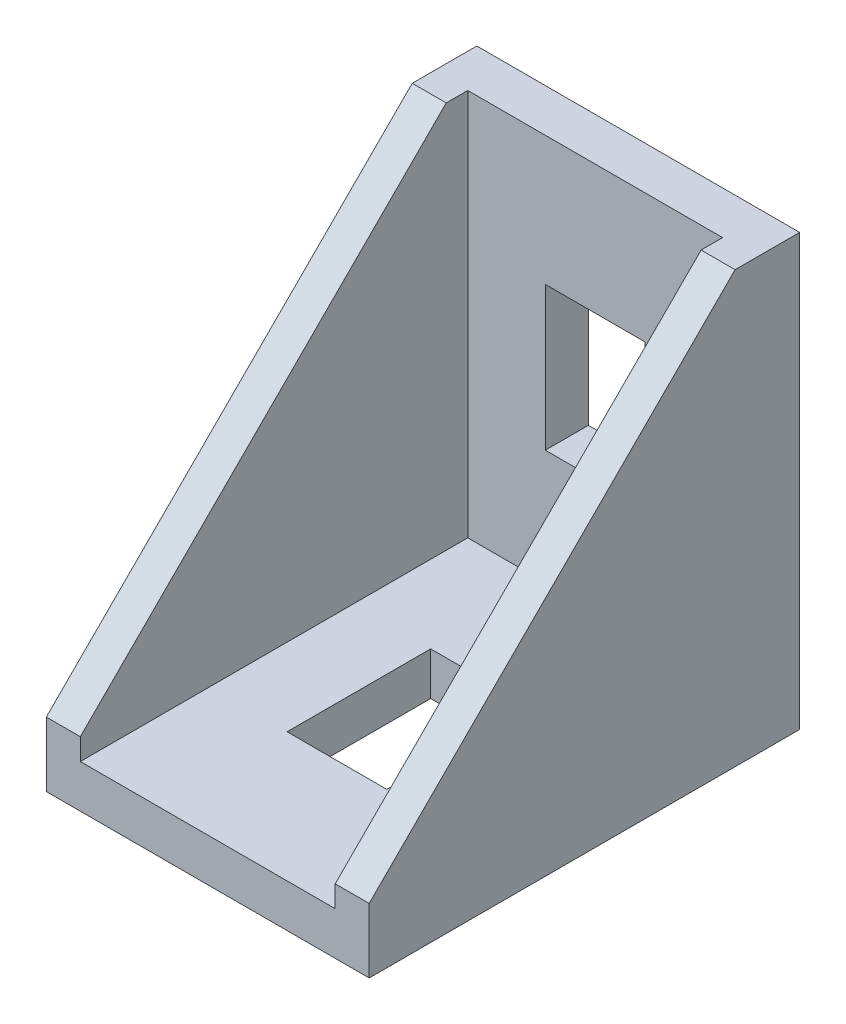
ISO-10303-21;
HEADER;
FILE_DESCRIPTION(('STEP AP214'),'2;1');
FILE_NAME('part.step','',(''),(''),'','','');
FILE_SCHEMA(('AUTOMOTIVE_DESIGN { 1 0 10303 214 1 1 1 1 }'));
ENDSEC;
DATA;
#1=APPLICATION_CONTEXT('core data for automotive mechanical design processes');
#2=APPLICATION_PROTOCOL_DEFINITION('international standard','automotive_design',2000,#1);
#3=PRODUCT_CONTEXT('',#1,'mechanical');
#4=PRODUCT('Part','Part','',(#3));
#5=PRODUCT_RELATED_PRODUCT_CATEGORY('part','',(#4));
#6=PRODUCT_DEFINITION_FORMATION('','',#4);
#7=PRODUCT_DEFINITION_CONTEXT('part definition',#1,'design');
#8=PRODUCT_DEFINITION('design','',#6,#7);
#9=PRODUCT_DEFINITION_SHAPE('','',#8);
#10=(LENGTH_UNIT() NAMED_UNIT(*) SI_UNIT(.MILLI.,.METRE.));
#11=(NAMED_UNIT(*) PLANE_ANGLE_UNIT() SI_UNIT($,.RADIAN.));
#12=(NAMED_UNIT(*) SI_UNIT($,.STERADIAN.) SOLID_ANGLE_UNIT());
#13=UNCERTAINTY_MEASURE_WITH_UNIT(LENGTH_MEASURE(1.E-05),#10,'distance_accuracy_value','');
#14=(GEOMETRIC_REPRESENTATION_CONTEXT(3) GLOBAL_UNCERTAINTY_ASSIGNED_CONTEXT((#13)) GLOBAL_UNIT_ASSIGNED_CONTEXT((#10,
#11,#12)) REPRESENTATION_CONTEXT('',''));
#15=CARTESIAN_POINT('',(0.,0.,0.));
#16=DIRECTION('',(0.,0.,1.));
#17=DIRECTION('',(1.,0.,0.));
#18=AXIS2_PLACEMENT_3D('',#15,#16,#17);
#19=CARTESIAN_POINT('',(-7.5,0.,20.));
#20=DIRECTION('',(0.,1.,0.));
#21=DIRECTION('',(0.,0.,1.));
#22=AXIS2_PLACEMENT_3D('',#19,#20,#21);
#23=PLANE('',#22);
#24=DIRECTION('',(0.,0.,1.));
#25=VECTOR('',#24,1.);
#26=CARTESIAN_POINT('',(7.5,0.,20.));
#27=LINE('',#26,#25);
#28=CARTESIAN_POINT('',(7.5,0.,0.));
#29=VERTEX_POINT('',#28);
#30=CARTESIAN_POINT('',(7.5,0.,20.));
#31=VERTEX_POINT('',#30);
#32=EDGE_CURVE('E352',#29,#31,#27,.T.);
#33=ORIENTED_EDGE('',*,*,#32,.T.);
#34=DIRECTION('',(1.,0.,0.));
#35=VECTOR('',#34,1.);
#36=CARTESIAN_POINT('',(-7.5,0.,20.));
#37=LINE('',#36,#35);
#38=CARTESIAN_POINT('',(-7.5,0.,20.));
#39=VERTEX_POINT('',#38);
#40=EDGE_CURVE('E404',#39,#31,#37,.T.);
#41=ORIENTED_EDGE('',*,*,#40,.F.);
#42=DIRECTION('',(0.,0.,1.));
#43=VECTOR('',#42,1.);
#44=CARTESIAN_POINT('',(-7.5,0.,20.));
#45=LINE('',#44,#43);
#46=CARTESIAN_POINT('',(-7.5,0.,0.));
#47=VERTEX_POINT('',#46);
#48=EDGE_CURVE('E401',#47,#39,#45,.T.);
#49=ORIENTED_EDGE('',*,*,#48,.F.);
#50=DIRECTION('',(1.,0.,0.));
#51=VECTOR('',#50,1.);
#52=CARTESIAN_POINT('',(-7.5,0.,0.));
#53=LINE('',#52,#51);
#54=EDGE_CURVE('E529',#47,#29,#53,.T.);
#55=ORIENTED_EDGE('',*,*,#54,.T.);
#56=EDGE_LOOP('',(#33,#41,#49,#55));
#57=FACE_BOUND('',#56,.T.);
#58=DIRECTION('',(0.,0.,1.));
#59=VECTOR('',#58,1.);
#60=CARTESIAN_POINT('',(-2.86,0.,16.73));
#61=LINE('',#60,#59);
#62=CARTESIAN_POINT('',(-2.86,0.,16.18));
#63=VERTEX_POINT('',#62);
#64=CARTESIAN_POINT('',(-2.86,0.,17.26));
#65=VERTEX_POINT('',#64);
#66=EDGE_CURVE('E363',#63,#65,#61,.T.);
#67=ORIENTED_EDGE('',*,*,#66,.T.);
#68=DIRECTION('',(1.,0.,0.));
#69=VECTOR('',#68,1.);
#70=CARTESIAN_POINT('',(0.,0.,17.26));
#71=LINE('',#70,#69);
#72=CARTESIAN_POINT('',(2.86,0.,17.26));
#73=VERTEX_POINT('',#72);
#74=EDGE_CURVE('E361',#65,#73,#71,.T.);
#75=ORIENTED_EDGE('',*,*,#74,.T.);
#76=DIRECTION('',(0.,0.,1.));
#77=VECTOR('',#76,1.);
#78=CARTESIAN_POINT('',(2.86,0.,16.73));
#79=LINE('',#78,#77);
#80=CARTESIAN_POINT('',(2.86,0.,16.18));
#81=VERTEX_POINT('',#80);
#82=EDGE_CURVE('E328',#81,#73,#79,.T.);
#83=ORIENTED_EDGE('',*,*,#82,.F.);
#84=DIRECTION('',(-1.,0.,0.));
#85=VECTOR('',#84,1.);
#86=CARTESIAN_POINT('',(0.,0.,16.18));
#87=LINE('',#86,#85);
#88=EDGE_CURVE('E366',#81,#63,#87,.T.);
#89=ORIENTED_EDGE('',*,*,#88,.T.);
#90=EDGE_LOOP('',(#67,#75,#83,#89));
#91=FACE_BOUND('',#90,.T.);
#92=DIRECTION('',(0.,0.,1.));
#93=VECTOR('',#92,1.);
#94=CARTESIAN_POINT('',(-2.86,0.,2.65));
#95=LINE('',#94,#93);
#96=CARTESIAN_POINT('',(-2.86,0.,2.1));
#97=VERTEX_POINT('',#96);
#98=CARTESIAN_POINT('',(-2.86,0.,3.18));
#99=VERTEX_POINT('',#98);
#100=EDGE_CURVE('E370',#97,#99,#95,.T.);
#101=ORIENTED_EDGE('',*,*,#100,.T.);
#102=DIRECTION('',(1.,0.,0.));
#103=VECTOR('',#102,1.);
#104=CARTESIAN_POINT('',(0.,0.,3.18));
#105=LINE('',#104,#103);
#106=CARTESIAN_POINT('',(2.86,0.,3.18));
#107=VERTEX_POINT('',#106);
#108=EDGE_CURVE('E283',#99,#107,#105,.T.);
#109=ORIENTED_EDGE('',*,*,#108,.T.);
#110=DIRECTION('',(0.,0.,1.));
#111=VECTOR('',#110,1.);
#112=CARTESIAN_POINT('',(2.86,0.,2.65));
#113=LINE('',#112,#111);
#114=CARTESIAN_POINT('',(2.86,0.,2.1));
#115=VERTEX_POINT('',#114);
#116=EDGE_CURVE('E331',#115,#107,#113,.T.);
#117=ORIENTED_EDGE('',*,*,#116,.F.);
#118=DIRECTION('',(-1.,0.,0.));
#119=VECTOR('',#118,1.);
#120=CARTESIAN_POINT('',(0.,0.,2.1));
#121=LINE('',#120,#119);
#122=EDGE_CURVE('E372',#115,#97,#121,.T.);
#123=ORIENTED_EDGE('',*,*,#122,.T.);
#124=EDGE_LOOP('',(#101,#109,#117,#123));
#125=FACE_BOUND('',#124,.T.);
#126=DIRECTION('',(0.,0.,-1.));
#127=VECTOR('',#126,1.);
#128=CARTESIAN_POINT('',(-2.315,0.,9.63000000000002));
#129=LINE('',#128,#127);
#130=CARTESIAN_POINT('',(-2.315,0.,14.));
#131=VERTEX_POINT('',#130);
#132=CARTESIAN_POINT('',(-2.315,0.,7.33));
#133=VERTEX_POINT('',#132);
#134=EDGE_CURVE('E381',#131,#133,#129,.T.);
#135=ORIENTED_EDGE('',*,*,#134,.F.);
#136=DIRECTION('',(-1.,0.,0.));
#137=VECTOR('',#136,1.);
#138=CARTESIAN_POINT('',(0.,0.,14.));
#139=LINE('',#138,#137);
#140=CARTESIAN_POINT('',(2.315,0.,14.));
#141=VERTEX_POINT('',#140);
#142=EDGE_CURVE('E384',#141,#131,#139,.T.);
#143=ORIENTED_EDGE('',*,*,#142,.F.);
#144=DIRECTION('',(0.,0.,-1.));
#145=VECTOR('',#144,1.);
#146=CARTESIAN_POINT('',(2.315,0.,9.63000000000002));
#147=LINE('',#146,#145);
#148=CARTESIAN_POINT('',(2.315,0.,7.33));
#149=VERTEX_POINT('',#148);
#150=EDGE_CURVE('E343',#141,#149,#147,.T.);
#151=ORIENTED_EDGE('',*,*,#150,.T.);
#152=DIRECTION('',(1.,0.,0.));
#153=VECTOR('',#152,1.);
#154=CARTESIAN_POINT('',(0.,0.,7.33));
#155=LINE('',#154,#153);
#156=EDGE_CURVE('E379',#133,#149,#155,.T.);
#157=ORIENTED_EDGE('',*,*,#156,.F.);
#158=EDGE_LOOP('',(#135,#143,#151,#157));
#159=FACE_BOUND('',#158,.T.);
#160=ADVANCED_FACE('F45',(#57,#91,#125,#159),#23,.F.);
#161=CARTESIAN_POINT('',(0.,1.99999999999999,20.));
#162=DIRECTION('',(0.,-1.,0.));
#163=DIRECTION('',(0.,0.,-1.));
#164=AXIS2_PLACEMENT_3D('',#161,#162,#163);
#165=PLANE('',#164);
#166=DIRECTION('',(-1.,0.,0.));
#167=VECTOR('',#166,1.);
#168=CARTESIAN_POINT('',(0.,1.99999999999999,20.));
#169=LINE('',#168,#167);
#170=CARTESIAN_POINT('',(5.92,1.99999999999999,20.));
#171=VERTEX_POINT('',#170);
#172=CARTESIAN_POINT('',(-5.92,1.99999999999999,20.));
#173=VERTEX_POINT('',#172);
#174=EDGE_CURVE('E392',#171,#173,#169,.T.);
#175=ORIENTED_EDGE('',*,*,#174,.F.);
#176=DIRECTION('',(0.,0.,-1.));
#177=VECTOR('',#176,1.);
#178=CARTESIAN_POINT('',(5.92,1.99999999999999,20.));
#179=LINE('',#178,#177);
#180=CARTESIAN_POINT('',(5.92,2.,2.));
#181=VERTEX_POINT('',#180);
#182=EDGE_CURVE('E349',#171,#181,#179,.T.);
#183=ORIENTED_EDGE('',*,*,#182,.T.);
#184=DIRECTION('',(-1.,0.,0.));
#185=VECTOR('',#184,1.);
#186=CARTESIAN_POINT('',(0.,2.,2.));
#187=LINE('',#186,#185);
#188=CARTESIAN_POINT('',(-5.92,2.,2.));
#189=VERTEX_POINT('',#188);
#190=EDGE_CURVE('E509',#181,#189,#187,.T.);
#191=ORIENTED_EDGE('',*,*,#190,.T.);
#192=DIRECTION('',(0.,0.,-1.));
#193=VECTOR('',#192,1.);
#194=CARTESIAN_POINT('',(-5.92,1.99999999999999,20.));
#195=LINE('',#194,#193);
#196=EDGE_CURVE('E395',#173,#189,#195,.T.);
#197=ORIENTED_EDGE('',*,*,#196,.F.);
#198=EDGE_LOOP('',(#175,#183,#191,#197));
#199=FACE_BOUND('',#198,.T.);
#200=DIRECTION('',(1.,0.,0.));
#201=VECTOR('',#200,1.);
#202=CARTESIAN_POINT('',(0.,1.99999999999999,14.));
#203=LINE('',#202,#201);
#204=CARTESIAN_POINT('',(-2.315,1.99999999999999,14.));
#205=VERTEX_POINT('',#204);
#206=CARTESIAN_POINT('',(2.315,1.99999999999999,14.));
#207=VERTEX_POINT('',#206);
#208=EDGE_CURVE('E387',#205,#207,#203,.T.);
#209=ORIENTED_EDGE('',*,*,#208,.F.);
#210=DIRECTION('',(0.,0.,1.));
#211=VECTOR('',#210,1.);
#212=CARTESIAN_POINT('',(-2.315,2.,9.63000000000002));
#213=LINE('',#212,#211);
#214=CARTESIAN_POINT('',(-2.315,1.99999999999999,7.33));
#215=VERTEX_POINT('',#214);
#216=EDGE_CURVE('E375',#215,#205,#213,.T.);
#217=ORIENTED_EDGE('',*,*,#216,.F.);
#218=DIRECTION('',(-1.,0.,0.));
#219=VECTOR('',#218,1.);
#220=CARTESIAN_POINT('',(0.,2.,7.33));
#221=LINE('',#220,#219);
#222=CARTESIAN_POINT('',(2.315,2.,7.33));
#223=VERTEX_POINT('',#222);
#224=EDGE_CURVE('E377',#223,#215,#221,.T.);
#225=ORIENTED_EDGE('',*,*,#224,.F.);
#226=DIRECTION('',(0.,0.,1.));
#227=VECTOR('',#226,1.);
#228=CARTESIAN_POINT('',(2.315,2.,9.63000000000002));
#229=LINE('',#228,#227);
#230=EDGE_CURVE('E338',#223,#207,#229,.T.);
#231=ORIENTED_EDGE('',*,*,#230,.T.);
#232=EDGE_LOOP('',(#209,#217,#225,#231));
#233=FACE_BOUND('',#232,.T.);
#234=ADVANCED_FACE('F569',(#199,#233),#165,.F.);
#235=CARTESIAN_POINT('',(7.5,11.5,11.5));
#236=DIRECTION('',(0.,-0.707106781186548,-0.707106781186547));
#237=DIRECTION('',(0.,0.707106781186547,-0.707106781186548));
#238=AXIS2_PLACEMENT_3D('',#235,#236,#237);
#239=PLANE('',#238);
#240=DIRECTION('',(0.,-0.707106781186547,0.707106781186548));
#241=VECTOR('',#240,1.);
#242=CARTESIAN_POINT('',(5.92,11.5,11.5));
#243=LINE('',#242,#241);
#244=CARTESIAN_POINT('',(5.92,20.,2.99999999999999));
#245=VERTEX_POINT('',#244);
#246=CARTESIAN_POINT('',(5.92,2.99999999999999,20.));
#247=VERTEX_POINT('',#246);
#248=EDGE_CURVE('E11',#245,#247,#243,.T.);
#249=ORIENTED_EDGE('',*,*,#248,.T.);
#250=DIRECTION('',(-1.,0.,0.));
#251=VECTOR('',#250,1.);
#252=CARTESIAN_POINT('',(7.5,2.99999999999999,20.));
#253=LINE('',#252,#251);
#254=CARTESIAN_POINT('',(7.5,2.99999999999999,20.));
#255=VERTEX_POINT('',#254);
#256=EDGE_CURVE('E358',#255,#247,#253,.T.);
#257=ORIENTED_EDGE('',*,*,#256,.F.);
#258=DIRECTION('',(0.,-0.707106781186547,0.707106781186548));
#259=VECTOR('',#258,1.);
#260=CARTESIAN_POINT('',(7.5,11.5,11.5));
#261=LINE('',#260,#259);
#262=CARTESIAN_POINT('',(7.5,20.,3.));
#263=VERTEX_POINT('',#262);
#264=EDGE_CURVE('E448',#263,#255,#261,.T.);
#265=ORIENTED_EDGE('',*,*,#264,.F.);
#266=DIRECTION('',(-1.,0.,0.));
#267=VECTOR('',#266,1.);
#268=CARTESIAN_POINT('',(7.5,20.,3.));
#269=LINE('',#268,#267);
#270=EDGE_CURVE('E455',#263,#245,#269,.T.);
#271=ORIENTED_EDGE('',*,*,#270,.T.);
#272=EDGE_LOOP('',(#249,#257,#265,#271));
#273=FACE_BOUND('',#272,.T.);
#274=ADVANCED_FACE('F563',(#273),#239,.F.);
#275=CARTESIAN_POINT('',(-7.5,2.99999999999999,20.));
#276=DIRECTION('',(0.,0.,-1.));
#277=DIRECTION('',(0.,1.,0.));
#278=AXIS2_PLACEMENT_3D('',#275,#276,#277);
#279=PLANE('',#278);
#280=DIRECTION('',(0.,1.,0.));
#281=VECTOR('',#280,1.);
#282=CARTESIAN_POINT('',(5.92,1.99999999999999,20.));
#283=LINE('',#282,#281);
#284=EDGE_CURVE('E346',#171,#247,#283,.T.);
#285=ORIENTED_EDGE('',*,*,#284,.F.);
#286=ORIENTED_EDGE('',*,*,#174,.T.);
#287=DIRECTION('',(0.,1.,0.));
#288=VECTOR('',#287,1.);
#289=CARTESIAN_POINT('',(-5.92,1.99999999999999,20.));
#290=LINE('',#289,#288);
#291=CARTESIAN_POINT('',(-5.92,2.99999999999999,20.));
#292=VERTEX_POINT('',#291);
#293=EDGE_CURVE('E389',#173,#292,#290,.T.);
#294=ORIENTED_EDGE('',*,*,#293,.T.);
#295=DIRECTION('',(1.,0.,0.));
#296=VECTOR('',#295,1.);
#297=CARTESIAN_POINT('',(-7.5,2.99999999999999,20.));
#298=LINE('',#297,#296);
#299=CARTESIAN_POINT('',(-7.5,2.99999999999999,20.));
#300=VERTEX_POINT('',#299);
#301=EDGE_CURVE('E403',#300,#292,#298,.T.);
#302=ORIENTED_EDGE('',*,*,#301,.F.);
#303=DIRECTION('',(0.,1.,0.));
#304=VECTOR('',#303,1.);
#305=CARTESIAN_POINT('',(-7.5,2.99999999999999,20.));
#306=LINE('',#305,#304);
#307=EDGE_CURVE('E398',#39,#300,#306,.T.);
#308=ORIENTED_EDGE('',*,*,#307,.F.);
#309=ORIENTED_EDGE('',*,*,#40,.T.);
#310=DIRECTION('',(0.,1.,0.));
#311=VECTOR('',#310,1.);
#312=CARTESIAN_POINT('',(7.5,2.99999999999999,20.));
#313=LINE('',#312,#311);
#314=EDGE_CURVE('E355',#31,#255,#313,.T.);
#315=ORIENTED_EDGE('',*,*,#314,.T.);
#316=ORIENTED_EDGE('',*,*,#256,.T.);
#317=EDGE_LOOP('',(#285,#286,#294,#302,#308,#309,#315,#316));
#318=FACE_BOUND('',#317,.T.);
#319=ADVANCED_FACE('F550',(#318),#279,.F.);
#320=CARTESIAN_POINT('',(-7.5,20.,0.));
#321=DIRECTION('',(0.,0.,-1.));
#322=DIRECTION('',(0.,1.,0.));
#323=AXIS2_PLACEMENT_3D('',#320,#321,#322);
#324=PLANE('',#323);
#325=DIRECTION('',(0.,1.,0.));
#326=VECTOR('',#325,1.);
#327=CARTESIAN_POINT('',(2.86,2.65,0.));
#328=LINE('',#327,#326);
#329=CARTESIAN_POINT('',(2.86,2.1,0.));
#330=VERTEX_POINT('',#329);
#331=CARTESIAN_POINT('',(2.86,3.18,0.));
#332=VERTEX_POINT('',#331);
#333=EDGE_CURVE('E428',#330,#332,#328,.T.);
#334=ORIENTED_EDGE('',*,*,#333,.T.);
#335=DIRECTION('',(1.,0.,0.));
#336=VECTOR('',#335,1.);
#337=CARTESIAN_POINT('',(0.,3.18,0.));
#338=LINE('',#337,#336);
#339=CARTESIAN_POINT('',(-2.86,3.18,0.));
#340=VERTEX_POINT('',#339);
#341=EDGE_CURVE('E489',#340,#332,#338,.T.);
#342=ORIENTED_EDGE('',*,*,#341,.F.);
#343=DIRECTION('',(0.,1.,0.));
#344=VECTOR('',#343,1.);
#345=CARTESIAN_POINT('',(-2.86,2.65,0.));
#346=LINE('',#345,#344);
#347=CARTESIAN_POINT('',(-2.86,2.1,0.));
#348=VERTEX_POINT('',#347);
#349=EDGE_CURVE('E67',#348,#340,#346,.T.);
#350=ORIENTED_EDGE('',*,*,#349,.F.);
#351=DIRECTION('',(-1.,0.,0.));
#352=VECTOR('',#351,1.);
#353=CARTESIAN_POINT('',(0.,2.1,0.));
#354=LINE('',#353,#352);
#355=EDGE_CURVE('E60',#330,#348,#354,.T.);
#356=ORIENTED_EDGE('',*,*,#355,.F.);
#357=EDGE_LOOP('',(#334,#342,#350,#356));
#358=FACE_BOUND('',#357,.T.);
#359=DIRECTION('',(0.,1.,0.));
#360=VECTOR('',#359,1.);
#361=CARTESIAN_POINT('',(2.86,16.73,0.));
#362=LINE('',#361,#360);
#363=CARTESIAN_POINT('',(2.86,16.18,0.));
#364=VERTEX_POINT('',#363);
#365=CARTESIAN_POINT('',(2.86,17.26,0.));
#366=VERTEX_POINT('',#365);
#367=EDGE_CURVE('E425',#364,#366,#362,.T.);
#368=ORIENTED_EDGE('',*,*,#367,.T.);
#369=DIRECTION('',(1.,0.,0.));
#370=VECTOR('',#369,1.);
#371=CARTESIAN_POINT('',(0.,17.26,0.));
#372=LINE('',#371,#370);
#373=CARTESIAN_POINT('',(-2.86,17.26,0.));
#374=VERTEX_POINT('',#373);
#375=EDGE_CURVE('E481',#374,#366,#372,.T.);
#376=ORIENTED_EDGE('',*,*,#375,.F.);
#377=DIRECTION('',(0.,1.,0.));
#378=VECTOR('',#377,1.);
#379=CARTESIAN_POINT('',(-2.86,16.73,0.));
#380=LINE('',#379,#378);
#381=CARTESIAN_POINT('',(-2.86,16.18,0.));
#382=VERTEX_POINT('',#381);
#383=EDGE_CURVE('E483',#382,#374,#380,.T.);
#384=ORIENTED_EDGE('',*,*,#383,.F.);
#385=DIRECTION('',(-1.,0.,0.));
#386=VECTOR('',#385,1.);
#387=CARTESIAN_POINT('',(0.,16.18,0.));
#388=LINE('',#387,#386);
#389=EDGE_CURVE('E485',#364,#382,#388,.T.);
#390=ORIENTED_EDGE('',*,*,#389,.F.);
#391=EDGE_LOOP('',(#368,#376,#384,#390));
#392=FACE_BOUND('',#391,.T.);
#393=DIRECTION('',(1.,0.,0.));
#394=VECTOR('',#393,1.);
#395=CARTESIAN_POINT('',(-7.5,20.,0.));
#396=LINE('',#395,#394);
#397=CARTESIAN_POINT('',(-7.5,20.,0.));
#398=VERTEX_POINT('',#397);
#399=CARTESIAN_POINT('',(7.5,20.,0.));
#400=VERTEX_POINT('',#399);
#401=EDGE_CURVE('E532',#398,#400,#396,.T.);
#402=ORIENTED_EDGE('',*,*,#401,.T.);
#403=DIRECTION('',(0.,1.,0.));
#404=VECTOR('',#403,1.);
#405=CARTESIAN_POINT('',(7.5,20.,0.));
#406=LINE('',#405,#404);
#407=EDGE_CURVE('E452',#29,#400,#406,.T.);
#408=ORIENTED_EDGE('',*,*,#407,.F.);
#409=ORIENTED_EDGE('',*,*,#54,.F.);
#410=DIRECTION('',(0.,1.,0.));
#411=VECTOR('',#410,1.);
#412=CARTESIAN_POINT('',(-7.5,20.,0.));
#413=LINE('',#412,#411);
#414=EDGE_CURVE('E521',#47,#398,#413,.T.);
#415=ORIENTED_EDGE('',*,*,#414,.T.);
#416=EDGE_LOOP('',(#402,#408,#409,#415));
#417=FACE_BOUND('',#416,.T.);
#418=DIRECTION('',(0.,-1.,0.));
#419=VECTOR('',#418,1.);
#420=CARTESIAN_POINT('',(2.315,9.63000000000002,0.));
#421=LINE('',#420,#419);
#422=CARTESIAN_POINT('',(2.315,14.,0.));
#423=VERTEX_POINT('',#422);
#424=CARTESIAN_POINT('',(2.315,7.33,0.));
#425=VERTEX_POINT('',#424);
#426=EDGE_CURVE('E440',#423,#425,#421,.T.);
#427=ORIENTED_EDGE('',*,*,#426,.F.);
#428=DIRECTION('',(-1.,0.,0.));
#429=VECTOR('',#428,1.);
#430=CARTESIAN_POINT('',(0.,14.,0.));
#431=LINE('',#430,#429);
#432=CARTESIAN_POINT('',(-2.315,14.,0.));
#433=VERTEX_POINT('',#432);
#434=EDGE_CURVE('E501',#423,#433,#431,.T.);
#435=ORIENTED_EDGE('',*,*,#434,.T.);
#436=DIRECTION('',(0.,-1.,0.));
#437=VECTOR('',#436,1.);
#438=CARTESIAN_POINT('',(-2.315,9.63000000000002,0.));
#439=LINE('',#438,#437);
#440=CARTESIAN_POINT('',(-2.315,7.33,0.));
#441=VERTEX_POINT('',#440);
#442=EDGE_CURVE('E503',#433,#441,#439,.T.);
#443=ORIENTED_EDGE('',*,*,#442,.T.);
#444=DIRECTION('',(1.,0.,0.));
#445=VECTOR('',#444,1.);
#446=CARTESIAN_POINT('',(0.,7.33,0.));
#447=LINE('',#446,#445);
#448=EDGE_CURVE('E505',#441,#425,#447,.T.);
#449=ORIENTED_EDGE('',*,*,#448,.T.);
#450=EDGE_LOOP('',(#427,#435,#443,#449));
#451=FACE_BOUND('',#450,.T.);
#452=ADVANCED_FACE('F47',(#358,#392,#417,#451),#324,.T.);
#453=CARTESIAN_POINT('',(0.,20.,2.));
#454=DIRECTION('',(0.,0.,1.));
#455=DIRECTION('',(1.,0.,0.));
#456=AXIS2_PLACEMENT_3D('',#453,#454,#455);
#457=PLANE('',#456);
#458=DIRECTION('',(0.,-1.,0.));
#459=VECTOR('',#458,1.);
#460=CARTESIAN_POINT('',(2.315,9.63000000000002,2.));
#461=LINE('',#460,#459);
#462=CARTESIAN_POINT('',(2.315,14.,2.));
#463=VERTEX_POINT('',#462);
#464=CARTESIAN_POINT('',(2.315,7.33,2.));
#465=VERTEX_POINT('',#464);
#466=EDGE_CURVE('E435',#463,#465,#461,.T.);
#467=ORIENTED_EDGE('',*,*,#466,.T.);
#468=DIRECTION('',(1.,0.,0.));
#469=VECTOR('',#468,1.);
#470=CARTESIAN_POINT('',(0.,7.33,2.));
#471=LINE('',#470,#469);
#472=CARTESIAN_POINT('',(-2.315,7.33,2.));
#473=VERTEX_POINT('',#472);
#474=EDGE_CURVE('E507',#473,#465,#471,.T.);
#475=ORIENTED_EDGE('',*,*,#474,.F.);
#476=DIRECTION('',(0.,-1.,0.));
#477=VECTOR('',#476,1.);
#478=CARTESIAN_POINT('',(-2.315,9.63000000000002,2.));
#479=LINE('',#478,#477);
#480=CARTESIAN_POINT('',(-2.315,14.,2.));
#481=VERTEX_POINT('',#480);
#482=EDGE_CURVE('E495',#481,#473,#479,.T.);
#483=ORIENTED_EDGE('',*,*,#482,.F.);
#484=DIRECTION('',(-1.,0.,0.));
#485=VECTOR('',#484,1.);
#486=CARTESIAN_POINT('',(0.,14.,2.));
#487=LINE('',#486,#485);
#488=EDGE_CURVE('E499',#463,#481,#487,.T.);
#489=ORIENTED_EDGE('',*,*,#488,.F.);
#490=EDGE_LOOP('',(#467,#475,#483,#489));
#491=FACE_BOUND('',#490,.T.);
#492=DIRECTION('',(0.,-1.,0.));
#493=VECTOR('',#492,1.);
#494=CARTESIAN_POINT('',(-5.92,20.,2.));
#495=LINE('',#494,#493);
#496=CARTESIAN_POINT('',(-5.92,20.,2.));
#497=VERTEX_POINT('',#496);
#498=EDGE_CURVE('E514',#497,#189,#495,.T.);
#499=ORIENTED_EDGE('',*,*,#498,.T.);
#500=ORIENTED_EDGE('',*,*,#190,.F.);
#501=DIRECTION('',(0.,-1.,0.));
#502=VECTOR('',#501,1.);
#503=CARTESIAN_POINT('',(5.92,20.,2.));
#504=LINE('',#503,#502);
#505=CARTESIAN_POINT('',(5.92,20.,2.));
#506=VERTEX_POINT('',#505);
#507=EDGE_CURVE('E446',#506,#181,#504,.T.);
#508=ORIENTED_EDGE('',*,*,#507,.F.);
#509=DIRECTION('',(-1.,0.,0.));
#510=VECTOR('',#509,1.);
#511=CARTESIAN_POINT('',(0.,20.,2.));
#512=LINE('',#511,#510);
#513=EDGE_CURVE('E510',#506,#497,#512,.T.);
#514=ORIENTED_EDGE('',*,*,#513,.T.);
#515=EDGE_LOOP('',(#499,#500,#508,#514));
#516=FACE_BOUND('',#515,.T.);
#517=ADVANCED_FACE('F578',(#491,#516),#457,.T.);
#518=CARTESIAN_POINT('',(-7.5,11.5,11.5));
#519=DIRECTION('',(0.,0.707106781186548,0.707106781186547));
#520=DIRECTION('',(0.,-0.707106781186547,0.707106781186548));
#521=AXIS2_PLACEMENT_3D('',#518,#519,#520);
#522=PLANE('',#521);
#523=ORIENTED_EDGE('',*,*,#301,.T.);
#524=DIRECTION('',(0.,0.707106781186547,-0.707106781186548));
#525=VECTOR('',#524,1.);
#526=CARTESIAN_POINT('',(-5.92,11.5,11.5));
#527=LINE('',#526,#525);
#528=CARTESIAN_POINT('',(-5.92,20.,3.));
#529=VERTEX_POINT('',#528);
#530=EDGE_CURVE('E518',#292,#529,#527,.T.);
#531=ORIENTED_EDGE('',*,*,#530,.T.);
#532=DIRECTION('',(1.,0.,0.));
#533=VECTOR('',#532,1.);
#534=CARTESIAN_POINT('',(-7.5,20.,3.));
#535=LINE('',#534,#533);
#536=CARTESIAN_POINT('',(-7.5,20.,3.));
#537=VERTEX_POINT('',#536);
#538=EDGE_CURVE('E53',#537,#529,#535,.T.);
#539=ORIENTED_EDGE('',*,*,#538,.F.);
#540=DIRECTION('',(0.,-0.707106781186547,0.707106781186548));
#541=VECTOR('',#540,1.);
#542=CARTESIAN_POINT('',(-7.5,11.5,11.5));
#543=LINE('',#542,#541);
#544=EDGE_CURVE('E527',#537,#300,#543,.T.);
#545=ORIENTED_EDGE('',*,*,#544,.T.);
#546=EDGE_LOOP('',(#523,#531,#539,#545));
#547=FACE_BOUND('',#546,.T.);
#548=ADVANCED_FACE('F576',(#547),#522,.T.);
#549=CARTESIAN_POINT('',(-7.5,20.,3.));
#550=DIRECTION('',(0.,1.,0.));
#551=DIRECTION('',(0.,0.,1.));
#552=AXIS2_PLACEMENT_3D('',#549,#550,#551);
#553=PLANE('',#552);
#554=DIRECTION('',(0.,0.,1.));
#555=VECTOR('',#554,1.);
#556=CARTESIAN_POINT('',(5.92,20.,2.));
#557=LINE('',#556,#555);
#558=EDGE_CURVE('E443',#506,#245,#557,.T.);
#559=ORIENTED_EDGE('',*,*,#558,.T.);
#560=ORIENTED_EDGE('',*,*,#270,.F.);
#561=DIRECTION('',(0.,0.,1.));
#562=VECTOR('',#561,1.);
#563=CARTESIAN_POINT('',(7.5,20.,3.));
#564=LINE('',#563,#562);
#565=EDGE_CURVE('E450',#400,#263,#564,.T.);
#566=ORIENTED_EDGE('',*,*,#565,.F.);
#567=ORIENTED_EDGE('',*,*,#401,.F.);
#568=DIRECTION('',(0.,0.,1.));
#569=VECTOR('',#568,1.);
#570=CARTESIAN_POINT('',(-7.5,20.,3.));
#571=LINE('',#570,#569);
#572=EDGE_CURVE('E524',#398,#537,#571,.T.);
#573=ORIENTED_EDGE('',*,*,#572,.T.);
#574=ORIENTED_EDGE('',*,*,#538,.T.);
#575=DIRECTION('',(0.,0.,1.));
#576=VECTOR('',#575,1.);
#577=CARTESIAN_POINT('',(-5.92,20.,2.));
#578=LINE('',#577,#576);
#579=EDGE_CURVE('E512',#497,#529,#578,.T.);
#580=ORIENTED_EDGE('',*,*,#579,.F.);
#581=ORIENTED_EDGE('',*,*,#513,.F.);
#582=EDGE_LOOP('',(#559,#560,#566,#567,#573,#574,#580,#581));
#583=FACE_BOUND('',#582,.T.);
#584=ADVANCED_FACE('F558',(#583),#553,.T.);
#585=CARTESIAN_POINT('',(-7.5,0.,0.));
#586=DIRECTION('',(1.,0.,0.));
#587=DIRECTION('',(0.,0.,-1.));
#588=AXIS2_PLACEMENT_3D('',#585,#586,#587);
#589=PLANE('',#588);
#590=ORIENTED_EDGE('',*,*,#414,.F.);
#591=ORIENTED_EDGE('',*,*,#48,.T.);
#592=ORIENTED_EDGE('',*,*,#307,.T.);
#593=ORIENTED_EDGE('',*,*,#544,.F.);
#594=ORIENTED_EDGE('',*,*,#572,.F.);
#595=EDGE_LOOP('',(#590,#591,#592,#593,#594));
#596=FACE_BOUND('',#595,.T.);
#597=ADVANCED_FACE('F555',(#596),#589,.F.);
#598=CARTESIAN_POINT('',(-5.92,20.,2.));
#599=DIRECTION('',(1.,0.,0.));
#600=DIRECTION('',(0.,0.,-1.));
#601=AXIS2_PLACEMENT_3D('',#598,#599,#600);
#602=PLANE('',#601);
#603=ORIENTED_EDGE('',*,*,#530,.F.);
#604=ORIENTED_EDGE('',*,*,#293,.F.);
#605=ORIENTED_EDGE('',*,*,#196,.T.);
#606=ORIENTED_EDGE('',*,*,#498,.F.);
#607=ORIENTED_EDGE('',*,*,#579,.T.);
#608=EDGE_LOOP('',(#603,#604,#605,#606,#607));
#609=FACE_BOUND('',#608,.T.);
#610=ADVANCED_FACE('F574',(#609),#602,.T.);
#611=CARTESIAN_POINT('',(0.,14.,11.501));
#612=DIRECTION('',(0.,-1.,0.));
#613=DIRECTION('',(0.,0.,-1.));
#614=AXIS2_PLACEMENT_3D('',#611,#612,#613);
#615=PLANE('',#614);
#616=ORIENTED_EDGE('',*,*,#488,.T.);
#617=DIRECTION('',(0.,0.,-1.));
#618=VECTOR('',#617,1.);
#619=CARTESIAN_POINT('',(-2.315,14.,11.501));
#620=LINE('',#619,#618);
#621=EDGE_CURVE('E491',#481,#433,#620,.T.);
#622=ORIENTED_EDGE('',*,*,#621,.T.);
#623=ORIENTED_EDGE('',*,*,#434,.F.);
#624=DIRECTION('',(0.,0.,-1.));
#625=VECTOR('',#624,1.);
#626=CARTESIAN_POINT('',(2.315,14.,11.501));
#627=LINE('',#626,#625);
#628=EDGE_CURVE('E432',#463,#423,#627,.T.);
#629=ORIENTED_EDGE('',*,*,#628,.F.);
#630=EDGE_LOOP('',(#616,#622,#623,#629));
#631=FACE_BOUND('',#630,.T.);
#632=ADVANCED_FACE('F654',(#631),#615,.T.);
#633=CARTESIAN_POINT('',(-2.315,9.63000000000002,11.501));
#634=DIRECTION('',(1.,0.,0.));
#635=DIRECTION('',(0.,0.,-1.));
#636=AXIS2_PLACEMENT_3D('',#633,#634,#635);
#637=PLANE('',#636);
#638=ORIENTED_EDGE('',*,*,#482,.T.);
#639=DIRECTION('',(0.,0.,-1.));
#640=VECTOR('',#639,1.);
#641=CARTESIAN_POINT('',(-2.315,7.33,11.501));
#642=LINE('',#641,#640);
#643=EDGE_CURVE('E492',#473,#441,#642,.T.);
#644=ORIENTED_EDGE('',*,*,#643,.T.);
#645=ORIENTED_EDGE('',*,*,#442,.F.);
#646=ORIENTED_EDGE('',*,*,#621,.F.);
#647=EDGE_LOOP('',(#638,#644,#645,#646));
#648=FACE_BOUND('',#647,.T.);
#649=ADVANCED_FACE('F650',(#648),#637,.T.);
#650=CARTESIAN_POINT('',(0.,7.33,11.501));
#651=DIRECTION('',(0.,1.,0.));
#652=DIRECTION('',(0.,0.,1.));
#653=AXIS2_PLACEMENT_3D('',#650,#651,#652);
#654=PLANE('',#653);
#655=ORIENTED_EDGE('',*,*,#474,.T.);
#656=DIRECTION('',(0.,0.,-1.));
#657=VECTOR('',#656,1.);
#658=CARTESIAN_POINT('',(2.315,7.33,11.501));
#659=LINE('',#658,#657);
#660=EDGE_CURVE('E431',#465,#425,#659,.T.);
#661=ORIENTED_EDGE('',*,*,#660,.T.);
#662=ORIENTED_EDGE('',*,*,#448,.F.);
#663=ORIENTED_EDGE('',*,*,#643,.F.);
#664=EDGE_LOOP('',(#655,#661,#662,#663));
#665=FACE_BOUND('',#664,.T.);
#666=ADVANCED_FACE('F647',(#665),#654,.T.);
#667=CARTESIAN_POINT('',(0.,2.1,-0.8));
#668=DIRECTION('',(0.,1.,0.));
#669=DIRECTION('',(0.,0.,1.));
#670=AXIS2_PLACEMENT_3D('',#667,#668,#669);
#671=PLANE('',#670);
#672=DIRECTION('',(-1.,0.,0.));
#673=VECTOR('',#672,1.);
#674=CARTESIAN_POINT('',(0.,2.1,-1.08));
#675=LINE('',#674,#673);
#676=CARTESIAN_POINT('',(2.86,2.1,-1.08));
#677=VERTEX_POINT('',#676);
#678=CARTESIAN_POINT('',(-2.86,2.1,-1.08));
#679=VERTEX_POINT('',#678);
#680=EDGE_CURVE('E467',#677,#679,#675,.T.);
#681=ORIENTED_EDGE('',*,*,#680,.F.);
#682=DIRECTION('',(0.,0.,1.));
#683=VECTOR('',#682,1.);
#684=CARTESIAN_POINT('',(2.86,2.1,-1.08));
#685=LINE('',#684,#683);
#686=EDGE_CURVE('E411',#677,#330,#685,.T.);
#687=ORIENTED_EDGE('',*,*,#686,.T.);
#688=ORIENTED_EDGE('',*,*,#355,.T.);
#689=DIRECTION('',(0.,0.,1.));
#690=VECTOR('',#689,1.);
#691=CARTESIAN_POINT('',(-2.86,2.1,-1.08));
#692=LINE('',#691,#690);
#693=EDGE_CURVE('E458',#679,#348,#692,.T.);
#694=ORIENTED_EDGE('',*,*,#693,.F.);
#695=EDGE_LOOP('',(#681,#687,#688,#694));
#696=FACE_BOUND('',#695,.T.);
#697=ADVANCED_FACE('F644',(#696),#671,.F.);
#698=CARTESIAN_POINT('',(-2.86,2.65,-0.8));
#699=DIRECTION('',(1.,0.,0.));
#700=DIRECTION('',(0.,0.,-1.));
#701=AXIS2_PLACEMENT_3D('',#698,#699,#700);
#702=PLANE('',#701);
#703=ORIENTED_EDGE('',*,*,#693,.T.);
#704=ORIENTED_EDGE('',*,*,#349,.T.);
#705=DIRECTION('',(0.,0.,1.));
#706=VECTOR('',#705,1.);
#707=CARTESIAN_POINT('',(-2.86,3.18,-1.08));
#708=LINE('',#707,#706);
#709=CARTESIAN_POINT('',(-2.86,3.18,-1.08));
#710=VERTEX_POINT('',#709);
#711=EDGE_CURVE('E460',#710,#340,#708,.T.);
#712=ORIENTED_EDGE('',*,*,#711,.F.);
#713=DIRECTION('',(0.,1.,0.));
#714=VECTOR('',#713,1.);
#715=CARTESIAN_POINT('',(-2.86,3.18,-1.08));
#716=LINE('',#715,#714);
#717=EDGE_CURVE('E465',#679,#710,#716,.T.);
#718=ORIENTED_EDGE('',*,*,#717,.F.);
#719=EDGE_LOOP('',(#703,#704,#712,#718));
#720=FACE_BOUND('',#719,.T.);
#721=ADVANCED_FACE('F640',(#720),#702,.F.);
#722=CARTESIAN_POINT('',(0.,3.18,-0.8));
#723=DIRECTION('',(0.,-1.,0.));
#724=DIRECTION('',(0.,0.,-1.));
#725=AXIS2_PLACEMENT_3D('',#722,#723,#724);
#726=PLANE('',#725);
#727=ORIENTED_EDGE('',*,*,#341,.T.);
#728=DIRECTION('',(0.,0.,1.));
#729=VECTOR('',#728,1.);
#730=CARTESIAN_POINT('',(2.86,3.18,-1.08));
#731=LINE('',#730,#729);
#732=CARTESIAN_POINT('',(2.86,3.18,-1.08));
#733=VERTEX_POINT('',#732);
#734=EDGE_CURVE('E413',#733,#332,#731,.T.);
#735=ORIENTED_EDGE('',*,*,#734,.F.);
#736=DIRECTION('',(1.,0.,0.));
#737=VECTOR('',#736,1.);
#738=CARTESIAN_POINT('',(0.,3.18,-1.08));
#739=LINE('',#738,#737);
#740=EDGE_CURVE('E463',#710,#733,#739,.T.);
#741=ORIENTED_EDGE('',*,*,#740,.F.);
#742=ORIENTED_EDGE('',*,*,#711,.T.);
#743=EDGE_LOOP('',(#727,#735,#741,#742));
#744=FACE_BOUND('',#743,.T.);
#745=ADVANCED_FACE('F630',(#744),#726,.F.);
#746=CARTESIAN_POINT('',(0.,16.18,-0.800000000000002));
#747=DIRECTION('',(0.,1.,0.));
#748=DIRECTION('',(0.,0.,1.));
#749=AXIS2_PLACEMENT_3D('',#746,#747,#748);
#750=PLANE('',#749);
#751=DIRECTION('',(-1.,0.,0.));
#752=VECTOR('',#751,1.);
#753=CARTESIAN_POINT('',(0.,16.18,-1.08));
#754=LINE('',#753,#752);
#755=CARTESIAN_POINT('',(2.86,16.18,-1.08));
#756=VERTEX_POINT('',#755);
#757=CARTESIAN_POINT('',(-2.86,16.18,-1.08));
#758=VERTEX_POINT('',#757);
#759=EDGE_CURVE('E469',#756,#758,#754,.T.);
#760=ORIENTED_EDGE('',*,*,#759,.F.);
#761=DIRECTION('',(0.,0.,1.));
#762=VECTOR('',#761,1.);
#763=CARTESIAN_POINT('',(2.86,16.18,-1.08));
#764=LINE('',#763,#762);
#765=EDGE_CURVE('E419',#756,#364,#764,.T.);
#766=ORIENTED_EDGE('',*,*,#765,.T.);
#767=ORIENTED_EDGE('',*,*,#389,.T.);
#768=DIRECTION('',(0.,0.,1.));
#769=VECTOR('',#768,1.);
#770=CARTESIAN_POINT('',(-2.86,16.18,-1.08));
#771=LINE('',#770,#769);
#772=EDGE_CURVE('E478',#758,#382,#771,.T.);
#773=ORIENTED_EDGE('',*,*,#772,.F.);
#774=EDGE_LOOP('',(#760,#766,#767,#773));
#775=FACE_BOUND('',#774,.T.);
#776=ADVANCED_FACE('F626',(#775),#750,.F.);
#777=CARTESIAN_POINT('',(-2.86,16.73,-0.800000000000002));
#778=DIRECTION('',(1.,0.,0.));
#779=DIRECTION('',(0.,0.,-1.));
#780=AXIS2_PLACEMENT_3D('',#777,#778,#779);
#781=PLANE('',#780);
#782=ORIENTED_EDGE('',*,*,#772,.T.);
#783=ORIENTED_EDGE('',*,*,#383,.T.);
#784=DIRECTION('',(0.,0.,1.));
#785=VECTOR('',#784,1.);
#786=CARTESIAN_POINT('',(-2.86,17.26,-1.08));
#787=LINE('',#786,#785);
#788=CARTESIAN_POINT('',(-2.86,17.26,-1.08));
#789=VERTEX_POINT('',#788);
#790=EDGE_CURVE('E475',#789,#374,#787,.T.);
#791=ORIENTED_EDGE('',*,*,#790,.F.);
#792=DIRECTION('',(0.,1.,0.));
#793=VECTOR('',#792,1.);
#794=CARTESIAN_POINT('',(-2.86,17.26,-1.08));
#795=LINE('',#794,#793);
#796=EDGE_CURVE('E471',#758,#789,#795,.T.);
#797=ORIENTED_EDGE('',*,*,#796,.F.);
#798=EDGE_LOOP('',(#782,#783,#791,#797));
#799=FACE_BOUND('',#798,.T.);
#800=ADVANCED_FACE('F629',(#799),#781,.F.);
#801=CARTESIAN_POINT('',(0.,17.26,-0.800000000000002));
#802=DIRECTION('',(0.,-1.,0.));
#803=DIRECTION('',(0.,0.,-1.));
#804=AXIS2_PLACEMENT_3D('',#801,#802,#803);
#805=PLANE('',#804);
#806=ORIENTED_EDGE('',*,*,#375,.T.);
#807=DIRECTION('',(0.,0.,1.));
#808=VECTOR('',#807,1.);
#809=CARTESIAN_POINT('',(2.86,17.26,-1.08));
#810=LINE('',#809,#808);
#811=CARTESIAN_POINT('',(2.86,17.26,-1.08));
#812=VERTEX_POINT('',#811);
#813=EDGE_CURVE('E422',#812,#366,#810,.T.);
#814=ORIENTED_EDGE('',*,*,#813,.F.);
#815=DIRECTION('',(1.,0.,0.));
#816=VECTOR('',#815,1.);
#817=CARTESIAN_POINT('',(0.,17.26,-1.08));
#818=LINE('',#817,#816);
#819=EDGE_CURVE('E473',#789,#812,#818,.T.);
#820=ORIENTED_EDGE('',*,*,#819,.F.);
#821=ORIENTED_EDGE('',*,*,#790,.T.);
#822=EDGE_LOOP('',(#806,#814,#820,#821));
#823=FACE_BOUND('',#822,.T.);
#824=ADVANCED_FACE('F624',(#823),#805,.F.);
#825=CARTESIAN_POINT('',(0.,0.,-1.08));
#826=DIRECTION('',(0.,0.,-1.));
#827=DIRECTION('',(0.,1.,0.));
#828=AXIS2_PLACEMENT_3D('',#825,#826,#827);
#829=PLANE('',#828);
#830=ORIENTED_EDGE('',*,*,#819,.T.);
#831=DIRECTION('',(0.,1.,0.));
#832=VECTOR('',#831,1.);
#833=CARTESIAN_POINT('',(2.86,17.26,-1.08));
#834=LINE('',#833,#832);
#835=EDGE_CURVE('E416',#756,#812,#834,.T.);
#836=ORIENTED_EDGE('',*,*,#835,.F.);
#837=ORIENTED_EDGE('',*,*,#759,.T.);
#838=ORIENTED_EDGE('',*,*,#796,.T.);
#839=EDGE_LOOP('',(#830,#836,#837,#838));
#840=FACE_BOUND('',#839,.T.);
#841=ADVANCED_FACE('F620',(#840),#829,.T.);
#842=CARTESIAN_POINT('',(0.,0.,-1.08));
#843=DIRECTION('',(0.,0.,-1.));
#844=DIRECTION('',(0.,1.,0.));
#845=AXIS2_PLACEMENT_3D('',#842,#843,#844);
#846=PLANE('',#845);
#847=ORIENTED_EDGE('',*,*,#740,.T.);
#848=DIRECTION('',(0.,1.,0.));
#849=VECTOR('',#848,1.);
#850=CARTESIAN_POINT('',(2.86,3.18,-1.08));
#851=LINE('',#850,#849);
#852=EDGE_CURVE('E406',#677,#733,#851,.T.);
#853=ORIENTED_EDGE('',*,*,#852,.F.);
#854=ORIENTED_EDGE('',*,*,#680,.T.);
#855=ORIENTED_EDGE('',*,*,#717,.T.);
#856=EDGE_LOOP('',(#847,#853,#854,#855));
#857=FACE_BOUND('',#856,.T.);
#858=ADVANCED_FACE('F615',(#857),#846,.T.);
#859=CARTESIAN_POINT('',(7.5,0.,0.));
#860=DIRECTION('',(-1.,0.,0.));
#861=DIRECTION('',(0.,0.,-1.));
#862=AXIS2_PLACEMENT_3D('',#859,#860,#861);
#863=PLANE('',#862);
#864=ORIENTED_EDGE('',*,*,#264,.T.);
#865=ORIENTED_EDGE('',*,*,#314,.F.);
#866=ORIENTED_EDGE('',*,*,#32,.F.);
#867=ORIENTED_EDGE('',*,*,#407,.T.);
#868=ORIENTED_EDGE('',*,*,#565,.T.);
#869=EDGE_LOOP('',(#864,#865,#866,#867,#868));
#870=FACE_BOUND('',#869,.T.);
#871=ADVANCED_FACE('F545',(#870),#863,.F.);
#872=CARTESIAN_POINT('',(5.92,20.,2.));
#873=DIRECTION('',(1.,0.,0.));
#874=DIRECTION('',(0.,0.,-1.));
#875=AXIS2_PLACEMENT_3D('',#872,#873,#874);
#876=PLANE('',#875);
#877=ORIENTED_EDGE('',*,*,#507,.T.);
#878=ORIENTED_EDGE('',*,*,#182,.F.);
#879=ORIENTED_EDGE('',*,*,#284,.T.);
#880=ORIENTED_EDGE('',*,*,#248,.F.);
#881=ORIENTED_EDGE('',*,*,#558,.F.);
#882=EDGE_LOOP('',(#877,#878,#879,#880,#881));
#883=FACE_BOUND('',#882,.T.);
#884=ADVANCED_FACE('F566',(#883),#876,.F.);
#885=CARTESIAN_POINT('',(2.315,9.63000000000002,11.501));
#886=DIRECTION('',(1.,0.,0.));
#887=DIRECTION('',(0.,0.,-1.));
#888=AXIS2_PLACEMENT_3D('',#885,#886,#887);
#889=PLANE('',#888);
#890=ORIENTED_EDGE('',*,*,#466,.F.);
#891=ORIENTED_EDGE('',*,*,#628,.T.);
#892=ORIENTED_EDGE('',*,*,#426,.T.);
#893=ORIENTED_EDGE('',*,*,#660,.F.);
#894=EDGE_LOOP('',(#890,#891,#892,#893));
#895=FACE_BOUND('',#894,.T.);
#896=ADVANCED_FACE('F606',(#895),#889,.F.);
#897=CARTESIAN_POINT('',(2.86,2.65,-0.8));
#898=DIRECTION('',(1.,0.,0.));
#899=DIRECTION('',(0.,0.,-1.));
#900=AXIS2_PLACEMENT_3D('',#897,#898,#899);
#901=PLANE('',#900);
#902=ORIENTED_EDGE('',*,*,#734,.T.);
#903=ORIENTED_EDGE('',*,*,#333,.F.);
#904=ORIENTED_EDGE('',*,*,#686,.F.);
#905=ORIENTED_EDGE('',*,*,#852,.T.);
#906=EDGE_LOOP('',(#902,#903,#904,#905));
#907=FACE_BOUND('',#906,.T.);
#908=ADVANCED_FACE('F602',(#907),#901,.T.);
#909=CARTESIAN_POINT('',(2.86,16.73,-0.800000000000002));
#910=DIRECTION('',(1.,0.,0.));
#911=DIRECTION('',(0.,0.,-1.));
#912=AXIS2_PLACEMENT_3D('',#909,#910,#911);
#913=PLANE('',#912);
#914=ORIENTED_EDGE('',*,*,#813,.T.);
#915=ORIENTED_EDGE('',*,*,#367,.F.);
#916=ORIENTED_EDGE('',*,*,#765,.F.);
#917=ORIENTED_EDGE('',*,*,#835,.T.);
#918=EDGE_LOOP('',(#914,#915,#916,#917));
#919=FACE_BOUND('',#918,.T.);
#920=ADVANCED_FACE('F599',(#919),#913,.T.);
#921=CARTESIAN_POINT('',(0.,20.001,7.33000000000001));
#922=DIRECTION('',(0.,0.,-1.));
#923=DIRECTION('',(0.,1.,0.));
#924=AXIS2_PLACEMENT_3D('',#921,#922,#923);
#925=PLANE('',#924);
#926=ORIENTED_EDGE('',*,*,#224,.T.);
#927=DIRECTION('',(0.,-1.,0.));
#928=VECTOR('',#927,1.);
#929=CARTESIAN_POINT('',(-2.315,20.001,7.33000000000001));
#930=LINE('',#929,#928);
#931=EDGE_CURVE('E303',#215,#133,#930,.T.);
#932=ORIENTED_EDGE('',*,*,#931,.T.);
#933=ORIENTED_EDGE('',*,*,#156,.T.);
#934=DIRECTION('',(0.,-1.,0.));
#935=VECTOR('',#934,1.);
#936=CARTESIAN_POINT('',(2.315,20.001,7.33000000000001));
#937=LINE('',#936,#935);
#938=EDGE_CURVE('E335',#223,#149,#937,.T.);
#939=ORIENTED_EDGE('',*,*,#938,.F.);
#940=EDGE_LOOP('',(#926,#932,#933,#939));
#941=FACE_BOUND('',#940,.T.);
#942=ADVANCED_FACE('F601',(#941),#925,.F.);
#943=CARTESIAN_POINT('',(-2.315,20.001,9.63000000000002));
#944=DIRECTION('',(-1.,0.,0.));
#945=DIRECTION('',(0.,0.,1.));
#946=AXIS2_PLACEMENT_3D('',#943,#944,#945);
#947=PLANE('',#946);
#948=ORIENTED_EDGE('',*,*,#216,.T.);
#949=DIRECTION('',(0.,-1.,0.));
#950=VECTOR('',#949,1.);
#951=CARTESIAN_POINT('',(-2.315,20.001,14.));
#952=LINE('',#951,#950);
#953=EDGE_CURVE('E304',#205,#131,#952,.T.);
#954=ORIENTED_EDGE('',*,*,#953,.T.);
#955=ORIENTED_EDGE('',*,*,#134,.T.);
#956=ORIENTED_EDGE('',*,*,#931,.F.);
#957=EDGE_LOOP('',(#948,#954,#955,#956));
#958=FACE_BOUND('',#957,.T.);
#959=ADVANCED_FACE('F707',(#958),#947,.F.);
#960=CARTESIAN_POINT('',(0.,20.001,14.));
#961=DIRECTION('',(0.,0.,1.));
#962=DIRECTION('',(0.,-1.,0.));
#963=AXIS2_PLACEMENT_3D('',#960,#961,#962);
#964=PLANE('',#963);
#965=ORIENTED_EDGE('',*,*,#208,.T.);
#966=DIRECTION('',(0.,-1.,0.));
#967=VECTOR('',#966,1.);
#968=CARTESIAN_POINT('',(2.315,20.001,14.));
#969=LINE('',#968,#967);
#970=EDGE_CURVE('E334',#207,#141,#969,.T.);
#971=ORIENTED_EDGE('',*,*,#970,.T.);
#972=ORIENTED_EDGE('',*,*,#142,.T.);
#973=ORIENTED_EDGE('',*,*,#953,.F.);
#974=EDGE_LOOP('',(#965,#971,#972,#973));
#975=FACE_BOUND('',#974,.T.);
#976=ADVANCED_FACE('F716',(#975),#964,.F.);
#977=CARTESIAN_POINT('',(0.,-0.800000000000001,3.18));
#978=DIRECTION('',(0.,0.,1.));
#979=DIRECTION('',(0.,-1.,0.));
#980=AXIS2_PLACEMENT_3D('',#977,#978,#979);
#981=PLANE('',#980);
#982=DIRECTION('',(0.,1.,0.));
#983=VECTOR('',#982,1.);
#984=CARTESIAN_POINT('',(2.86,-1.08,3.18));
#985=LINE('',#984,#983);
#986=CARTESIAN_POINT('',(2.86,-1.08,3.18));
#987=VERTEX_POINT('',#986);
#988=EDGE_CURVE('E278',#987,#107,#985,.T.);
#989=ORIENTED_EDGE('',*,*,#988,.T.);
#990=ORIENTED_EDGE('',*,*,#108,.F.);
#991=DIRECTION('',(0.,1.,0.));
#992=VECTOR('',#991,1.);
#993=CARTESIAN_POINT('',(-2.86,-1.08,3.18));
#994=LINE('',#993,#992);
#995=CARTESIAN_POINT('',(-2.86,-1.08,3.18));
#996=VERTEX_POINT('',#995);
#997=EDGE_CURVE('E281',#996,#99,#994,.T.);
#998=ORIENTED_EDGE('',*,*,#997,.F.);
#999=DIRECTION('',(-1.,0.,0.));
#1000=VECTOR('',#999,1.);
#1001=CARTESIAN_POINT('',(0.,-1.08,3.18));
#1002=LINE('',#1001,#1000);
#1003=EDGE_CURVE('E268',#987,#996,#1002,.T.);
#1004=ORIENTED_EDGE('',*,*,#1003,.F.);
#1005=EDGE_LOOP('',(#989,#990,#998,#1004));
#1006=FACE_BOUND('',#1005,.T.);
#1007=ADVANCED_FACE('F282',(#1006),#981,.T.);
#1008=CARTESIAN_POINT('',(-2.86,-0.800000000000001,2.65));
#1009=DIRECTION('',(-1.,0.,0.));
#1010=DIRECTION('',(0.,0.,1.));
#1011=AXIS2_PLACEMENT_3D('',#1008,#1009,#1010);
#1012=PLANE('',#1011);
#1013=ORIENTED_EDGE('',*,*,#997,.T.);
#1014=ORIENTED_EDGE('',*,*,#100,.F.);
#1015=DIRECTION('',(0.,1.,0.));
#1016=VECTOR('',#1015,1.);
#1017=CARTESIAN_POINT('',(-2.86,-1.08,2.1));
#1018=LINE('',#1017,#1016);
#1019=CARTESIAN_POINT('',(-2.86,-1.08,2.1));
#1020=VERTEX_POINT('',#1019);
#1021=EDGE_CURVE('E287',#1020,#97,#1018,.T.);
#1022=ORIENTED_EDGE('',*,*,#1021,.F.);
#1023=DIRECTION('',(0.,0.,1.));
#1024=VECTOR('',#1023,1.);
#1025=CARTESIAN_POINT('',(-2.86,-1.08,3.18));
#1026=LINE('',#1025,#1024);
#1027=EDGE_CURVE('E272',#1020,#996,#1026,.T.);
#1028=ORIENTED_EDGE('',*,*,#1027,.T.);
#1029=EDGE_LOOP('',(#1013,#1014,#1022,#1028));
#1030=FACE_BOUND('',#1029,.T.);
#1031=ADVANCED_FACE('F290',(#1030),#1012,.T.);
#1032=CARTESIAN_POINT('',(0.,-0.800000000000001,2.1));
#1033=DIRECTION('',(0.,0.,-1.));
#1034=DIRECTION('',(0.,1.,0.));
#1035=AXIS2_PLACEMENT_3D('',#1032,#1033,#1034);
#1036=PLANE('',#1035);
#1037=ORIENTED_EDGE('',*,*,#1021,.T.);
#1038=ORIENTED_EDGE('',*,*,#122,.F.);
#1039=DIRECTION('',(0.,1.,0.));
#1040=VECTOR('',#1039,1.);
#1041=CARTESIAN_POINT('',(2.86,-1.08,2.1));
#1042=LINE('',#1041,#1040);
#1043=CARTESIAN_POINT('',(2.86,-1.08,2.1));
#1044=VERTEX_POINT('',#1043);
#1045=EDGE_CURVE('E313',#1044,#115,#1042,.T.);
#1046=ORIENTED_EDGE('',*,*,#1045,.F.);
#1047=DIRECTION('',(1.,0.,0.));
#1048=VECTOR('',#1047,1.);
#1049=CARTESIAN_POINT('',(0.,-1.08,2.1));
#1050=LINE('',#1049,#1048);
#1051=EDGE_CURVE('E307',#1020,#1044,#1050,.T.);
#1052=ORIENTED_EDGE('',*,*,#1051,.F.);
#1053=EDGE_LOOP('',(#1037,#1038,#1046,#1052));
#1054=FACE_BOUND('',#1053,.T.);
#1055=ADVANCED_FACE('F741',(#1054),#1036,.T.);
#1056=CARTESIAN_POINT('',(0.,-0.800000000000005,17.26));
#1057=DIRECTION('',(0.,0.,1.));
#1058=DIRECTION('',(0.,-1.,0.));
#1059=AXIS2_PLACEMENT_3D('',#1056,#1057,#1058);
#1060=PLANE('',#1059);
#1061=DIRECTION('',(0.,1.,0.));
#1062=VECTOR('',#1061,1.);
#1063=CARTESIAN_POINT('',(2.86,-1.08000000000001,17.26));
#1064=LINE('',#1063,#1062);
#1065=CARTESIAN_POINT('',(2.86,-1.08000000000001,17.26));
#1066=VERTEX_POINT('',#1065);
#1067=EDGE_CURVE('E322',#1066,#73,#1064,.T.);
#1068=ORIENTED_EDGE('',*,*,#1067,.T.);
#1069=ORIENTED_EDGE('',*,*,#74,.F.);
#1070=DIRECTION('',(0.,1.,0.));
#1071=VECTOR('',#1070,1.);
#1072=CARTESIAN_POINT('',(-2.86,-1.08000000000001,17.26));
#1073=LINE('',#1072,#1071);
#1074=CARTESIAN_POINT('',(-2.86,-1.08000000000001,17.26));
#1075=VERTEX_POINT('',#1074);
#1076=EDGE_CURVE('E300',#1075,#65,#1073,.T.);
#1077=ORIENTED_EDGE('',*,*,#1076,.F.);
#1078=DIRECTION('',(-1.,0.,0.));
#1079=VECTOR('',#1078,1.);
#1080=CARTESIAN_POINT('',(0.,-1.08000000000001,17.26));
#1081=LINE('',#1080,#1079);
#1082=EDGE_CURVE('E320',#1066,#1075,#1081,.T.);
#1083=ORIENTED_EDGE('',*,*,#1082,.F.);
#1084=EDGE_LOOP('',(#1068,#1069,#1077,#1083));
#1085=FACE_BOUND('',#1084,.T.);
#1086=ADVANCED_FACE('F749',(#1085),#1060,.T.);
#1087=CARTESIAN_POINT('',(-2.86,-0.800000000000005,16.73));
#1088=DIRECTION('',(-1.,0.,0.));
#1089=DIRECTION('',(0.,0.,1.));
#1090=AXIS2_PLACEMENT_3D('',#1087,#1088,#1089);
#1091=PLANE('',#1090);
#1092=ORIENTED_EDGE('',*,*,#1076,.T.);
#1093=ORIENTED_EDGE('',*,*,#66,.F.);
#1094=DIRECTION('',(0.,1.,0.));
#1095=VECTOR('',#1094,1.);
#1096=CARTESIAN_POINT('',(-2.86,-1.08,16.18));
#1097=LINE('',#1096,#1095);
#1098=CARTESIAN_POINT('',(-2.86,-1.08,16.18));
#1099=VERTEX_POINT('',#1098);
#1100=EDGE_CURVE('E297',#1099,#63,#1097,.T.);
#1101=ORIENTED_EDGE('',*,*,#1100,.F.);
#1102=DIRECTION('',(0.,0.,1.));
#1103=VECTOR('',#1102,1.);
#1104=CARTESIAN_POINT('',(-2.86,-1.08000000000001,17.26));
#1105=LINE('',#1104,#1103);
#1106=EDGE_CURVE('E286',#1099,#1075,#1105,.T.);
#1107=ORIENTED_EDGE('',*,*,#1106,.T.);
#1108=EDGE_LOOP('',(#1092,#1093,#1101,#1107));
#1109=FACE_BOUND('',#1108,.T.);
#1110=ADVANCED_FACE('F758',(#1109),#1091,.T.);
#1111=CARTESIAN_POINT('',(0.,-0.800000000000005,16.18));
#1112=DIRECTION('',(0.,0.,-1.));
#1113=DIRECTION('',(0.,1.,0.));
#1114=AXIS2_PLACEMENT_3D('',#1111,#1112,#1113);
#1115=PLANE('',#1114);
#1116=ORIENTED_EDGE('',*,*,#1100,.T.);
#1117=ORIENTED_EDGE('',*,*,#88,.F.);
#1118=DIRECTION('',(0.,1.,0.));
#1119=VECTOR('',#1118,1.);
#1120=CARTESIAN_POINT('',(2.86,-1.08,16.18));
#1121=LINE('',#1120,#1119);
#1122=CARTESIAN_POINT('',(2.86,-1.08,16.18));
#1123=VERTEX_POINT('',#1122);
#1124=EDGE_CURVE('E325',#1123,#81,#1121,.T.);
#1125=ORIENTED_EDGE('',*,*,#1124,.F.);
#1126=DIRECTION('',(1.,0.,0.));
#1127=VECTOR('',#1126,1.);
#1128=CARTESIAN_POINT('',(0.,-1.08,16.18));
#1129=LINE('',#1128,#1127);
#1130=EDGE_CURVE('E316',#1099,#1123,#1129,.T.);
#1131=ORIENTED_EDGE('',*,*,#1130,.F.);
#1132=EDGE_LOOP('',(#1116,#1117,#1125,#1131));
#1133=FACE_BOUND('',#1132,.T.);
#1134=ADVANCED_FACE('F767',(#1133),#1115,.T.);
#1135=CARTESIAN_POINT('',(2.315,20.001,9.63000000000002));
#1136=DIRECTION('',(-1.,0.,0.));
#1137=DIRECTION('',(0.,0.,1.));
#1138=AXIS2_PLACEMENT_3D('',#1135,#1136,#1137);
#1139=PLANE('',#1138);
#1140=ORIENTED_EDGE('',*,*,#230,.F.);
#1141=ORIENTED_EDGE('',*,*,#938,.T.);
#1142=ORIENTED_EDGE('',*,*,#150,.F.);
#1143=ORIENTED_EDGE('',*,*,#970,.F.);
#1144=EDGE_LOOP('',(#1140,#1141,#1142,#1143));
#1145=FACE_BOUND('',#1144,.T.);
#1146=ADVANCED_FACE('F776',(#1145),#1139,.T.);
#1147=CARTESIAN_POINT('',(2.86,-0.800000000000001,2.65));
#1148=DIRECTION('',(-1.,0.,0.));
#1149=DIRECTION('',(0.,0.,1.));
#1150=AXIS2_PLACEMENT_3D('',#1147,#1148,#1149);
#1151=PLANE('',#1150);
#1152=ORIENTED_EDGE('',*,*,#1045,.T.);
#1153=ORIENTED_EDGE('',*,*,#116,.T.);
#1154=ORIENTED_EDGE('',*,*,#988,.F.);
#1155=DIRECTION('',(0.,0.,1.));
#1156=VECTOR('',#1155,1.);
#1157=CARTESIAN_POINT('',(2.86,-1.08,3.18));
#1158=LINE('',#1157,#1156);
#1159=EDGE_CURVE('E274',#1044,#987,#1158,.T.);
#1160=ORIENTED_EDGE('',*,*,#1159,.F.);
#1161=EDGE_LOOP('',(#1152,#1153,#1154,#1160));
#1162=FACE_BOUND('',#1161,.T.);
#1163=ADVANCED_FACE('F786',(#1162),#1151,.F.);
#1164=CARTESIAN_POINT('',(2.86,-0.800000000000005,16.73));
#1165=DIRECTION('',(-1.,0.,0.));
#1166=DIRECTION('',(0.,0.,1.));
#1167=AXIS2_PLACEMENT_3D('',#1164,#1165,#1166);
#1168=PLANE('',#1167);
#1169=ORIENTED_EDGE('',*,*,#1124,.T.);
#1170=ORIENTED_EDGE('',*,*,#82,.T.);
#1171=ORIENTED_EDGE('',*,*,#1067,.F.);
#1172=DIRECTION('',(0.,0.,1.));
#1173=VECTOR('',#1172,1.);
#1174=CARTESIAN_POINT('',(2.86,-1.08000000000001,17.26));
#1175=LINE('',#1174,#1173);
#1176=EDGE_CURVE('E318',#1123,#1066,#1175,.T.);
#1177=ORIENTED_EDGE('',*,*,#1176,.F.);
#1178=EDGE_LOOP('',(#1169,#1170,#1171,#1177));
#1179=FACE_BOUND('',#1178,.T.);
#1180=ADVANCED_FACE('F796',(#1179),#1168,.F.);
#1181=CARTESIAN_POINT('',(0.,-1.08,0.));
#1182=DIRECTION('',(0.,-1.,0.));
#1183=DIRECTION('',(0.,0.,1.));
#1184=AXIS2_PLACEMENT_3D('',#1181,#1182,#1183);
#1185=PLANE('',#1184);
#1186=ORIENTED_EDGE('',*,*,#1082,.T.);
#1187=ORIENTED_EDGE('',*,*,#1106,.F.);
#1188=ORIENTED_EDGE('',*,*,#1130,.T.);
#1189=ORIENTED_EDGE('',*,*,#1176,.T.);
#1190=EDGE_LOOP('',(#1186,#1187,#1188,#1189));
#1191=FACE_BOUND('',#1190,.T.);
#1192=ADVANCED_FACE('F805',(#1191),#1185,.T.);
#1193=CARTESIAN_POINT('',(0.,-1.08,0.));
#1194=DIRECTION('',(0.,-1.,0.));
#1195=DIRECTION('',(0.,0.,1.));
#1196=AXIS2_PLACEMENT_3D('',#1193,#1194,#1195);
#1197=PLANE('',#1196);
#1198=ORIENTED_EDGE('',*,*,#1003,.T.);
#1199=ORIENTED_EDGE('',*,*,#1027,.F.);
#1200=ORIENTED_EDGE('',*,*,#1051,.T.);
#1201=ORIENTED_EDGE('',*,*,#1159,.T.);
#1202=EDGE_LOOP('',(#1198,#1199,#1200,#1201));
#1203=FACE_BOUND('',#1202,.T.);
#1204=ADVANCED_FACE('F270',(#1203),#1197,.T.);
#1205=CLOSED_SHELL('',(#160,#234,#274,#319,#452,#517,#548,#584,#597,#610,#632,#649,#666,#697,
#721,#745,#776,#800,#824,#841,#858,#871,#884,#896,#908,#920,#942,#959,#976,#1007,#1031,#1055,
#1086,#1110,#1134,#1146,#1163,#1180,#1192,#1204));
#1206=MANIFOLD_SOLID_BREP('B2',#1205);
#1207=ADVANCED_BREP_SHAPE_REPRESENTATION('',(#18,#1206),#14);
#1208=SHAPE_DEFINITION_REPRESENTATION(#9,#1207);
ENDSEC;
END-ISO-10303-21;
